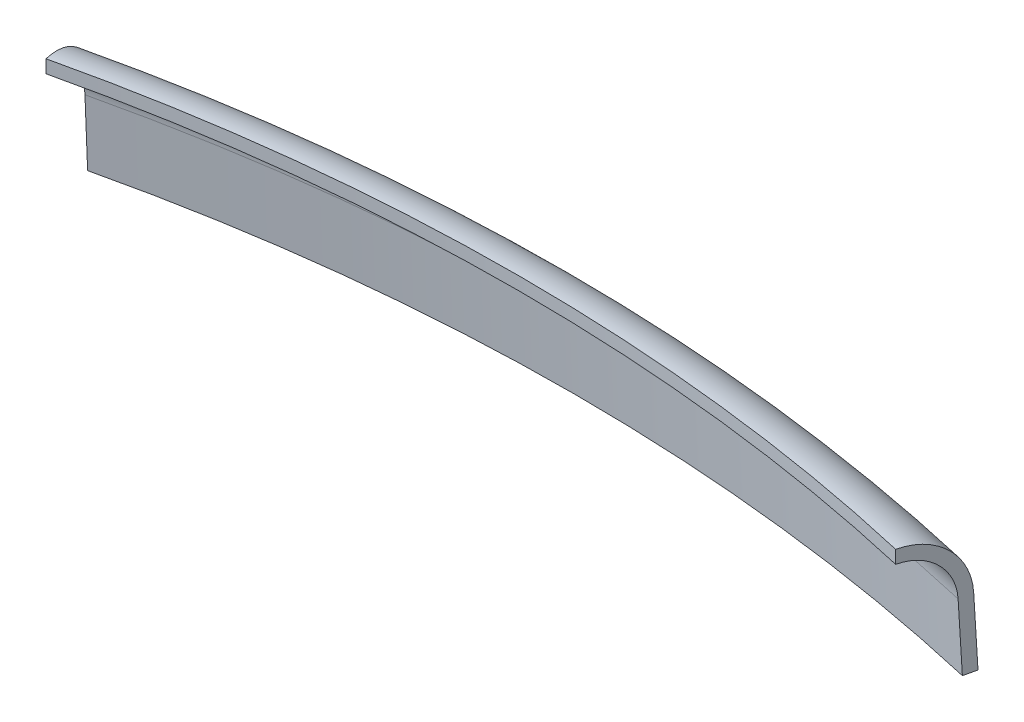
ISO-10303-21;
HEADER;
FILE_DESCRIPTION(('STEP AP214'),'2;1');
FILE_NAME('part.step','',(''),(''),'','','');
FILE_SCHEMA(('AUTOMOTIVE_DESIGN { 1 0 10303 214 1 1 1 1 }'));
ENDSEC;
DATA;
#1=APPLICATION_CONTEXT('core data for automotive mechanical design processes');
#2=APPLICATION_PROTOCOL_DEFINITION('international standard','automotive_design',2000,#1);
#3=PRODUCT_CONTEXT('',#1,'mechanical');
#4=PRODUCT('Part','Part','',(#3));
#5=PRODUCT_RELATED_PRODUCT_CATEGORY('part','',(#4));
#6=PRODUCT_DEFINITION_FORMATION('','',#4);
#7=PRODUCT_DEFINITION_CONTEXT('part definition',#1,'design');
#8=PRODUCT_DEFINITION('design','',#6,#7);
#9=PRODUCT_DEFINITION_SHAPE('','',#8);
#10=(LENGTH_UNIT() NAMED_UNIT(*) SI_UNIT(.MILLI.,.METRE.));
#11=(NAMED_UNIT(*) PLANE_ANGLE_UNIT() SI_UNIT($,.RADIAN.));
#12=(NAMED_UNIT(*) SI_UNIT($,.STERADIAN.) SOLID_ANGLE_UNIT());
#13=UNCERTAINTY_MEASURE_WITH_UNIT(LENGTH_MEASURE(1.E-05),#10,'distance_accuracy_value','');
#14=(GEOMETRIC_REPRESENTATION_CONTEXT(3) GLOBAL_UNCERTAINTY_ASSIGNED_CONTEXT((#13)) GLOBAL_UNIT_ASSIGNED_CONTEXT((#10,
#11,#12)) REPRESENTATION_CONTEXT('',''));
#15=CARTESIAN_POINT('',(0.,0.,0.));
#16=DIRECTION('',(0.,0.,1.));
#17=DIRECTION('',(1.,0.,0.));
#18=AXIS2_PLACEMENT_3D('',#15,#16,#17);
#19=CARTESIAN_POINT('',(0.,0.,0.));
#20=DIRECTION('',(0.,1.,0.));
#21=DIRECTION('',(0.,0.,1.));
#22=AXIS2_PLACEMENT_3D('',#19,#20,#21);
#23=PLANE('',#22);
#24=DIRECTION('',(0.225411918087087,0.,0.974263551193567));
#25=VECTOR('',#24,1.);
#26=CARTESIAN_POINT('',(-32.6241147166548,0.,-16.0062348438679));
#27=LINE('',#26,#25);
#28=CARTESIAN_POINT('',(-33.811787713063,0.,-21.1395326790351));
#29=VERTEX_POINT('',#28);
#30=CARTESIAN_POINT('',(-33.5860664518322,0.,-20.1639321011561));
#31=VERTEX_POINT('',#30);
#32=EDGE_CURVE('E130',#29,#31,#27,.T.);
#33=ORIENTED_EDGE('',*,*,#32,.F.);
#34=CARTESIAN_POINT('',(0.,0.,125.));
#35=DIRECTION('',(0.,1.,0.));
#36=DIRECTION('',(0.225411918087087,0.,-0.974263551193567));
#37=AXIS2_PLACEMENT_3D('',#34,#35,#36);
#38=CIRCLE('',#37,150.);
#39=CARTESIAN_POINT('',(33.811787713063,0.,-21.1395326790351));
#40=VERTEX_POINT('',#39);
#41=EDGE_CURVE('E125',#40,#29,#38,.T.);
#42=ORIENTED_EDGE('',*,*,#41,.F.);
#43=DIRECTION('',(-0.225411918087087,0.,0.974263551193567));
#44=VECTOR('',#43,1.);
#45=CARTESIAN_POINT('',(32.6241147166548,0.,-16.0062348438679));
#46=LINE('',#45,#44);
#47=CARTESIAN_POINT('',(33.5860664518322,0.,-20.1639321011561));
#48=VERTEX_POINT('',#47);
#49=EDGE_CURVE('E36',#40,#48,#46,.T.);
#50=ORIENTED_EDGE('',*,*,#49,.T.);
#51=CARTESIAN_POINT('',(0.,0.,125.));
#52=DIRECTION('',(0.,1.,0.));
#53=DIRECTION('',(0.225411918087086,0.,-0.974263551193567));
#54=AXIS2_PLACEMENT_3D('',#51,#52,#53);
#55=CIRCLE('',#54,148.998627654002);
#56=EDGE_CURVE('E11',#48,#31,#55,.T.);
#57=ORIENTED_EDGE('',*,*,#56,.T.);
#58=EDGE_LOOP('',(#33,#42,#50,#57));
#59=FACE_BOUND('',#58,.T.);
#60=ADVANCED_FACE('F33',(#59),#23,.F.);
#61=CARTESIAN_POINT('',(0.,0.,125.));
#62=DIRECTION('',(0.,-1.,0.));
#63=DIRECTION('',(0.,0.,1.));
#64=AXIS2_PLACEMENT_3D('',#61,#62,#63);
#65=CYLINDRICAL_SURFACE('',#64,144.731099373595);
#66=CARTESIAN_POINT('',(0.,10.,125.));
#67=DIRECTION('',(0.,1.,0.));
#68=DIRECTION('',(0.225411918087087,0.,-0.974263551193567));
#69=AXIS2_PLACEMENT_3D('',#66,#67,#68);
#70=CIRCLE('',#69,144.731099373595);
#71=CARTESIAN_POINT('',(32.6241147166548,10.,-16.0062348438679));
#72=VERTEX_POINT('',#71);
#73=CARTESIAN_POINT('',(-32.6241147166548,10.,-16.0062348438679));
#74=VERTEX_POINT('',#73);
#75=EDGE_CURVE('E112',#72,#74,#70,.T.);
#76=ORIENTED_EDGE('',*,*,#75,.T.);
#77=DIRECTION('',(0.,1.,0.));
#78=VECTOR('',#77,1.);
#79=CARTESIAN_POINT('',(-32.6241147166548,10.,-16.0062348438679));
#80=LINE('',#79,#78);
#81=CARTESIAN_POINT('',(-32.6241147166548,9.00000000000002,-16.0062348438679));
#82=VERTEX_POINT('',#81);
#83=EDGE_CURVE('E110',#82,#74,#80,.T.);
#84=ORIENTED_EDGE('',*,*,#83,.F.);
#85=CARTESIAN_POINT('',(0.,9.00000000000002,125.));
#86=DIRECTION('',(0.,1.,0.));
#87=DIRECTION('',(0.225411918087087,0.,-0.974263551193567));
#88=AXIS2_PLACEMENT_3D('',#85,#86,#87);
#89=CIRCLE('',#88,144.731099373595);
#90=CARTESIAN_POINT('',(32.6241147166548,9.00000000000002,-16.0062348438679));
#91=VERTEX_POINT('',#90);
#92=EDGE_CURVE('E92',#91,#82,#89,.T.);
#93=ORIENTED_EDGE('',*,*,#92,.F.);
#94=DIRECTION('',(0.,1.,0.));
#95=VECTOR('',#94,1.);
#96=CARTESIAN_POINT('',(32.6241147166548,10.,-16.0062348438679));
#97=LINE('',#96,#95);
#98=EDGE_CURVE('E103',#91,#72,#97,.T.);
#99=ORIENTED_EDGE('',*,*,#98,.T.);
#100=EDGE_LOOP('',(#76,#84,#93,#99));
#101=FACE_BOUND('',#100,.T.);
#102=ADVANCED_FACE('F142',(#101),#65,.F.);
#103=CARTESIAN_POINT('',(32.6241147166548,-5.,-16.0062348438679));
#104=DIRECTION('',(0.974263551193567,0.,0.225411918087087));
#105=DIRECTION('',(-0.225411918087087,0.,0.974263551193567));
#106=AXIS2_PLACEMENT_3D('',#103,#104,#105);
#107=PLANE('',#106);
#108=ORIENTED_EDGE('',*,*,#49,.F.);
#109=DIRECTION('',(0.0117971482816449,-0.998629534754574,-0.0509890145843663));
#110=VECTOR('',#109,1.);
#111=CARTESIAN_POINT('',(33.749629711092,5.26167978121472,-20.8708766281518));
#112=LINE('',#111,#110);
#113=CARTESIAN_POINT('',(33.749629711092,5.26167978121472,-20.8708766281518));
#114=VERTEX_POINT('',#113);
#115=EDGE_CURVE('E93',#114,#40,#112,.T.);
#116=ORIENTED_EDGE('',*,*,#115,.F.);
#117=CARTESIAN_POINT('',(32.6241147166548,5.,-16.0062348438679));
#118=DIRECTION('',(-0.974263551193567,0.,-0.225411918087087));
#119=DIRECTION('',(-0.225411918087087,0.,0.974263551193567));
#120=AXIS2_PLACEMENT_3D('',#117,#118,#119);
#121=CIRCLE('',#120,5.);
#122=EDGE_CURVE('E105',#72,#114,#121,.T.);
#123=ORIENTED_EDGE('',*,*,#122,.F.);
#124=ORIENTED_EDGE('',*,*,#98,.F.);
#125=CARTESIAN_POINT('',(32.6241147166548,5.,-16.0062348438679));
#126=DIRECTION('',(0.974263551193567,0.,0.225411918087087));
#127=DIRECTION('',(-0.225411918087087,0.,0.974263551193567));
#128=AXIS2_PLACEMENT_3D('',#125,#126,#127);
#129=CIRCLE('',#128,4.00000000000002);
#130=CARTESIAN_POINT('',(33.5245267122046,5.20934382497178,-19.897948271295));
#131=VERTEX_POINT('',#130);
#132=EDGE_CURVE('E87',#131,#91,#129,.T.);
#133=ORIENTED_EDGE('',*,*,#132,.F.);
#134=DIRECTION('',(-0.0117971482816442,0.998629534754574,0.0509890145843632));
#135=VECTOR('',#134,1.);
#136=CARTESIAN_POINT('',(33.5245267122046,5.20934382497178,-19.897948271295));
#137=LINE('',#136,#135);
#138=EDGE_CURVE('E96',#48,#131,#137,.T.);
#139=ORIENTED_EDGE('',*,*,#138,.F.);
#140=EDGE_LOOP('',(#108,#116,#123,#124,#133,#139));
#141=FACE_BOUND('',#140,.T.);
#142=ADVANCED_FACE('F100',(#141),#107,.T.);
#143=CARTESIAN_POINT('',(0.,5.,125.));
#144=DIRECTION('',(0.,-1.,0.));
#145=DIRECTION('',(0.,0.,1.));
#146=AXIS2_PLACEMENT_3D('',#143,#144,#145);
#147=TOROIDAL_SURFACE('',#146,144.731099373595,5.);
#148=CARTESIAN_POINT('',(0.,5.26167978121472,125.));
#149=DIRECTION('',(0.,1.,0.));
#150=DIRECTION('',(0.225411918087087,0.,-0.974263551193567));
#151=AXIS2_PLACEMENT_3D('',#148,#149,#150);
#152=CIRCLE('',#151,149.724247047368);
#153=CARTESIAN_POINT('',(-33.749629711092,5.26167978121472,-20.8708766281518));
#154=VERTEX_POINT('',#153);
#155=EDGE_CURVE('E118',#114,#154,#152,.T.);
#156=ORIENTED_EDGE('',*,*,#155,.T.);
#157=CARTESIAN_POINT('',(-32.6241147166548,5.,-16.0062348438679));
#158=DIRECTION('',(-0.974263551193567,0.,0.225411918087087));
#159=DIRECTION('',(0.225411918087087,0.,0.974263551193567));
#160=AXIS2_PLACEMENT_3D('',#157,#158,#159);
#161=CIRCLE('',#160,5.);
#162=EDGE_CURVE('E116',#74,#154,#161,.T.);
#163=ORIENTED_EDGE('',*,*,#162,.F.);
#164=ORIENTED_EDGE('',*,*,#75,.F.);
#165=ORIENTED_EDGE('',*,*,#122,.T.);
#166=EDGE_LOOP('',(#156,#163,#164,#165));
#167=FACE_BOUND('',#166,.T.);
#168=ADVANCED_FACE('F139',(#167),#147,.T.);
#169=CARTESIAN_POINT('',(-32.6241147166548,-5.,-16.0062348438679));
#170=DIRECTION('',(0.974263551193567,0.,-0.225411918087087));
#171=DIRECTION('',(0.225411918087087,0.,0.974263551193567));
#172=AXIS2_PLACEMENT_3D('',#169,#170,#171);
#173=PLANE('',#172);
#174=DIRECTION('',(-0.0117971482816449,-0.998629534754574,-0.0509890145843663));
#175=VECTOR('',#174,1.);
#176=CARTESIAN_POINT('',(-33.749629711092,5.26167978121472,-20.8708766281518));
#177=LINE('',#176,#175);
#178=EDGE_CURVE('E123',#154,#29,#177,.T.);
#179=ORIENTED_EDGE('',*,*,#178,.T.);
#180=ORIENTED_EDGE('',*,*,#32,.T.);
#181=DIRECTION('',(0.0117971482816442,0.998629534754574,0.0509890145843632));
#182=VECTOR('',#181,1.);
#183=CARTESIAN_POINT('',(-33.5245267122046,5.20934382497178,-19.897948271295));
#184=LINE('',#183,#182);
#185=CARTESIAN_POINT('',(-33.5245267122046,5.20934382497178,-19.897948271295));
#186=VERTEX_POINT('',#185);
#187=EDGE_CURVE('E111',#31,#186,#184,.T.);
#188=ORIENTED_EDGE('',*,*,#187,.T.);
#189=CARTESIAN_POINT('',(-32.6241147166548,5.,-16.0062348438679));
#190=DIRECTION('',(0.974263551193567,0.,-0.225411918087087));
#191=DIRECTION('',(0.225411918087087,0.,0.974263551193567));
#192=AXIS2_PLACEMENT_3D('',#189,#190,#191);
#193=CIRCLE('',#192,4.00000000000002);
#194=EDGE_CURVE('E90',#186,#82,#193,.T.);
#195=ORIENTED_EDGE('',*,*,#194,.T.);
#196=ORIENTED_EDGE('',*,*,#83,.T.);
#197=ORIENTED_EDGE('',*,*,#162,.T.);
#198=EDGE_LOOP('',(#179,#180,#188,#195,#196,#197));
#199=FACE_BOUND('',#198,.T.);
#200=ADVANCED_FACE('F143',(#199),#173,.F.);
#201=CARTESIAN_POINT('',(0.,5.26167978121472,125.));
#202=DIRECTION('',(0.,-1.,0.));
#203=DIRECTION('',(0.,0.,1.));
#204=AXIS2_PLACEMENT_3D('',#201,#202,#203);
#205=CONICAL_SURFACE('',#204,149.724247047368,0.052359877559834);
#206=ORIENTED_EDGE('',*,*,#41,.T.);
#207=ORIENTED_EDGE('',*,*,#178,.F.);
#208=ORIENTED_EDGE('',*,*,#155,.F.);
#209=ORIENTED_EDGE('',*,*,#115,.T.);
#210=EDGE_LOOP('',(#206,#207,#208,#209));
#211=FACE_BOUND('',#210,.T.);
#212=ADVANCED_FACE('F135',(#211),#205,.T.);
#213=CARTESIAN_POINT('',(0.,5.,125.));
#214=DIRECTION('',(0.,-1.,0.));
#215=DIRECTION('',(0.,0.,1.));
#216=AXIS2_PLACEMENT_3D('',#213,#214,#215);
#217=TOROIDAL_SURFACE('',#216,144.731099373595,4.00000000000002);
#218=ORIENTED_EDGE('',*,*,#92,.T.);
#219=ORIENTED_EDGE('',*,*,#194,.F.);
#220=CARTESIAN_POINT('',(0.,5.20934382497178,125.));
#221=DIRECTION('',(0.,1.,0.));
#222=DIRECTION('',(0.225411918087087,0.,-0.974263551193567));
#223=AXIS2_PLACEMENT_3D('',#220,#221,#222);
#224=CIRCLE('',#223,148.725617512614);
#225=EDGE_CURVE('E84',#131,#186,#224,.T.);
#226=ORIENTED_EDGE('',*,*,#225,.F.);
#227=ORIENTED_EDGE('',*,*,#132,.T.);
#228=EDGE_LOOP('',(#218,#219,#226,#227));
#229=FACE_BOUND('',#228,.T.);
#230=ADVANCED_FACE('F85',(#229),#217,.F.);
#231=CARTESIAN_POINT('',(0.,0.,125.));
#232=DIRECTION('',(0.,-1.,0.));
#233=DIRECTION('',(0.,0.,1.));
#234=AXIS2_PLACEMENT_3D('',#231,#232,#233);
#235=CONICAL_SURFACE('',#234,148.998627654002,0.0523598775598282);
#236=ORIENTED_EDGE('',*,*,#225,.T.);
#237=ORIENTED_EDGE('',*,*,#187,.F.);
#238=ORIENTED_EDGE('',*,*,#56,.F.);
#239=ORIENTED_EDGE('',*,*,#138,.T.);
#240=EDGE_LOOP('',(#236,#237,#238,#239));
#241=FACE_BOUND('',#240,.T.);
#242=ADVANCED_FACE('F97',(#241),#235,.F.);
#243=CLOSED_SHELL('',(#60,#102,#142,#168,#200,#212,#230,#242));
#244=MANIFOLD_SOLID_BREP('B2',#243);
#245=ADVANCED_BREP_SHAPE_REPRESENTATION('',(#18,#244),#14);
#246=SHAPE_DEFINITION_REPRESENTATION(#9,#245);
ENDSEC;
END-ISO-10303-21;
